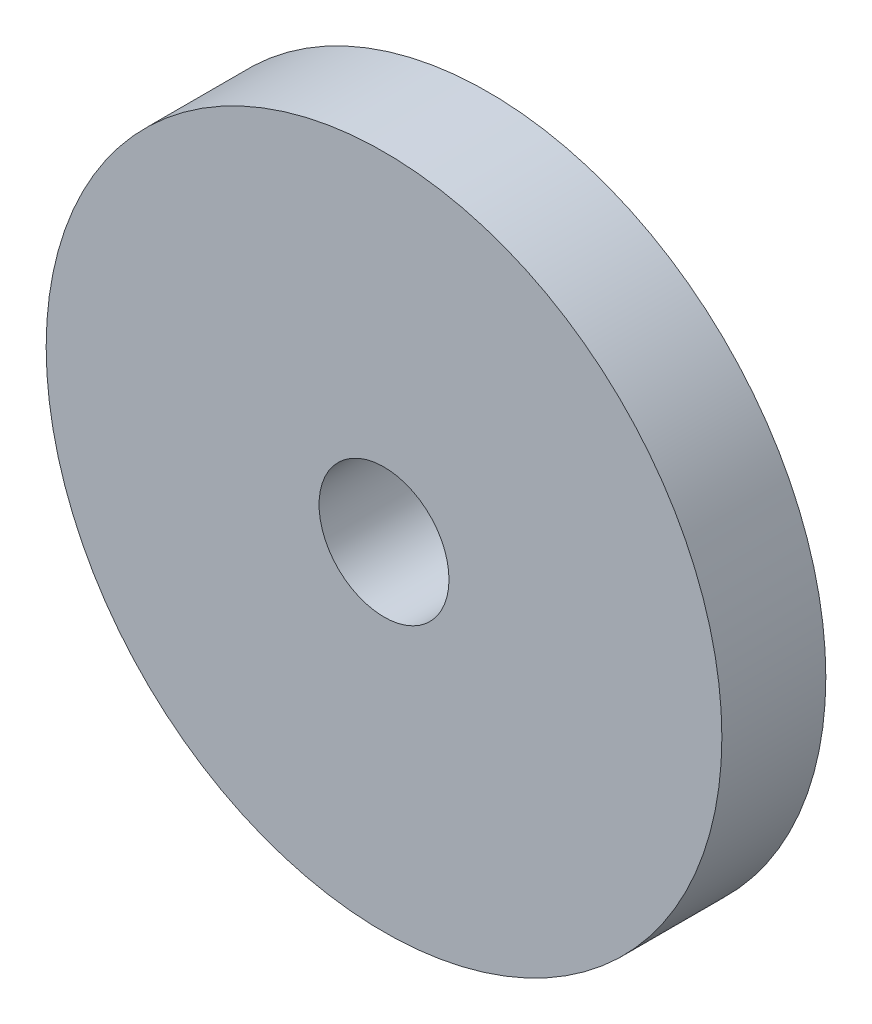
ISO-10303-21;
HEADER;
FILE_DESCRIPTION(('STEP AP214'),'2;1');
FILE_NAME('part.step','',(''),(''),'','','');
FILE_SCHEMA(('AUTOMOTIVE_DESIGN { 1 0 10303 214 1 1 1 1 }'));
ENDSEC;
DATA;
#1=APPLICATION_CONTEXT('core data for automotive mechanical design processes');
#2=APPLICATION_PROTOCOL_DEFINITION('international standard','automotive_design',2000,#1);
#3=PRODUCT_CONTEXT('',#1,'mechanical');
#4=PRODUCT('Part','Part','',(#3));
#5=PRODUCT_RELATED_PRODUCT_CATEGORY('part','',(#4));
#6=PRODUCT_DEFINITION_FORMATION('','',#4);
#7=PRODUCT_DEFINITION_CONTEXT('part definition',#1,'design');
#8=PRODUCT_DEFINITION('design','',#6,#7);
#9=PRODUCT_DEFINITION_SHAPE('','',#8);
#10=(LENGTH_UNIT() NAMED_UNIT(*) SI_UNIT(.MILLI.,.METRE.));
#11=(NAMED_UNIT(*) PLANE_ANGLE_UNIT() SI_UNIT($,.RADIAN.));
#12=(NAMED_UNIT(*) SI_UNIT($,.STERADIAN.) SOLID_ANGLE_UNIT());
#13=UNCERTAINTY_MEASURE_WITH_UNIT(LENGTH_MEASURE(1.E-05),#10,'distance_accuracy_value','');
#14=(GEOMETRIC_REPRESENTATION_CONTEXT(3) GLOBAL_UNCERTAINTY_ASSIGNED_CONTEXT((#13)) GLOBAL_UNIT_ASSIGNED_CONTEXT((#10,
#11,#12)) REPRESENTATION_CONTEXT('',''));
#15=CARTESIAN_POINT('',(0.,0.,0.));
#16=DIRECTION('',(0.,0.,1.));
#17=DIRECTION('',(1.,0.,0.));
#18=AXIS2_PLACEMENT_3D('',#15,#16,#17);
#19=CARTESIAN_POINT('',(0.,0.,40.));
#20=DIRECTION('',(0.,0.,1.));
#21=DIRECTION('',(1.,0.,0.));
#22=AXIS2_PLACEMENT_3D('',#19,#20,#21);
#23=PLANE('',#22);
#24=CARTESIAN_POINT('',(0.,0.,40.));
#25=DIRECTION('',(0.,0.,1.));
#26=DIRECTION('',(1.,0.,0.));
#27=AXIS2_PLACEMENT_3D('',#24,#25,#26);
#28=CIRCLE('',#27,130.);
#29=CARTESIAN_POINT('',(130.,0.,40.));
#30=VERTEX_POINT('',#29);
#31=EDGE_CURVE('E10',#30,#30,#28,.T.);
#32=ORIENTED_EDGE('',*,*,#31,.T.);
#33=EDGE_LOOP('',(#32));
#34=FACE_BOUND('',#33,.T.);
#35=CARTESIAN_POINT('',(0.,0.,40.));
#36=DIRECTION('',(0.,0.,1.));
#37=DIRECTION('',(1.,0.,0.));
#38=AXIS2_PLACEMENT_3D('',#35,#36,#37);
#39=CIRCLE('',#38,25.);
#40=CARTESIAN_POINT('',(25.,0.,40.));
#41=VERTEX_POINT('',#40);
#42=EDGE_CURVE('E50',#41,#41,#39,.T.);
#43=ORIENTED_EDGE('',*,*,#42,.F.);
#44=EDGE_LOOP('',(#43));
#45=FACE_BOUND('',#44,.T.);
#46=ADVANCED_FACE('F39',(#34,#45),#23,.T.);
#47=CARTESIAN_POINT('',(0.,0.,0.));
#48=DIRECTION('',(0.,0.,1.));
#49=DIRECTION('',(1.,0.,0.));
#50=AXIS2_PLACEMENT_3D('',#47,#48,#49);
#51=PLANE('',#50);
#52=CARTESIAN_POINT('',(0.,0.,0.));
#53=DIRECTION('',(0.,0.,1.));
#54=DIRECTION('',(1.,0.,0.));
#55=AXIS2_PLACEMENT_3D('',#52,#53,#54);
#56=CIRCLE('',#55,130.);
#57=CARTESIAN_POINT('',(130.,0.,0.));
#58=VERTEX_POINT('',#57);
#59=EDGE_CURVE('E43',#58,#58,#56,.T.);
#60=ORIENTED_EDGE('',*,*,#59,.F.);
#61=EDGE_LOOP('',(#60));
#62=FACE_BOUND('',#61,.T.);
#63=CARTESIAN_POINT('',(0.,0.,0.));
#64=DIRECTION('',(0.,0.,1.));
#65=DIRECTION('',(1.,0.,0.));
#66=AXIS2_PLACEMENT_3D('',#63,#64,#65);
#67=CIRCLE('',#66,25.);
#68=CARTESIAN_POINT('',(25.,0.,0.));
#69=VERTEX_POINT('',#68);
#70=EDGE_CURVE('E52',#69,#69,#67,.T.);
#71=ORIENTED_EDGE('',*,*,#70,.T.);
#72=EDGE_LOOP('',(#71));
#73=FACE_BOUND('',#72,.T.);
#74=ADVANCED_FACE('F62',(#62,#73),#51,.F.);
#75=CARTESIAN_POINT('',(0.,0.,40.));
#76=DIRECTION('',(0.,0.,-1.));
#77=DIRECTION('',(-1.,0.,0.));
#78=AXIS2_PLACEMENT_3D('',#75,#76,#77);
#79=CYLINDRICAL_SURFACE('',#78,130.);
#80=ORIENTED_EDGE('',*,*,#31,.F.);
#81=EDGE_LOOP('',(#80));
#82=FACE_BOUND('',#81,.T.);
#83=ORIENTED_EDGE('',*,*,#59,.T.);
#84=EDGE_LOOP('',(#83));
#85=FACE_BOUND('',#84,.T.);
#86=ADVANCED_FACE('F41',(#82,#85),#79,.T.);
#87=CARTESIAN_POINT('',(0.,0.,40.));
#88=DIRECTION('',(0.,0.,-1.));
#89=DIRECTION('',(-1.,0.,0.));
#90=AXIS2_PLACEMENT_3D('',#87,#88,#89);
#91=CYLINDRICAL_SURFACE('',#90,25.);
#92=ORIENTED_EDGE('',*,*,#42,.T.);
#93=EDGE_LOOP('',(#92));
#94=FACE_BOUND('',#93,.T.);
#95=ORIENTED_EDGE('',*,*,#70,.F.);
#96=EDGE_LOOP('',(#95));
#97=FACE_BOUND('',#96,.T.);
#98=ADVANCED_FACE('F58',(#94,#97),#91,.F.);
#99=CLOSED_SHELL('',(#46,#74,#86,#98));
#100=MANIFOLD_SOLID_BREP('B2',#99);
#101=ADVANCED_BREP_SHAPE_REPRESENTATION('',(#18,#100),#14);
#102=SHAPE_DEFINITION_REPRESENTATION(#9,#101);
ENDSEC;
END-ISO-10303-21;
